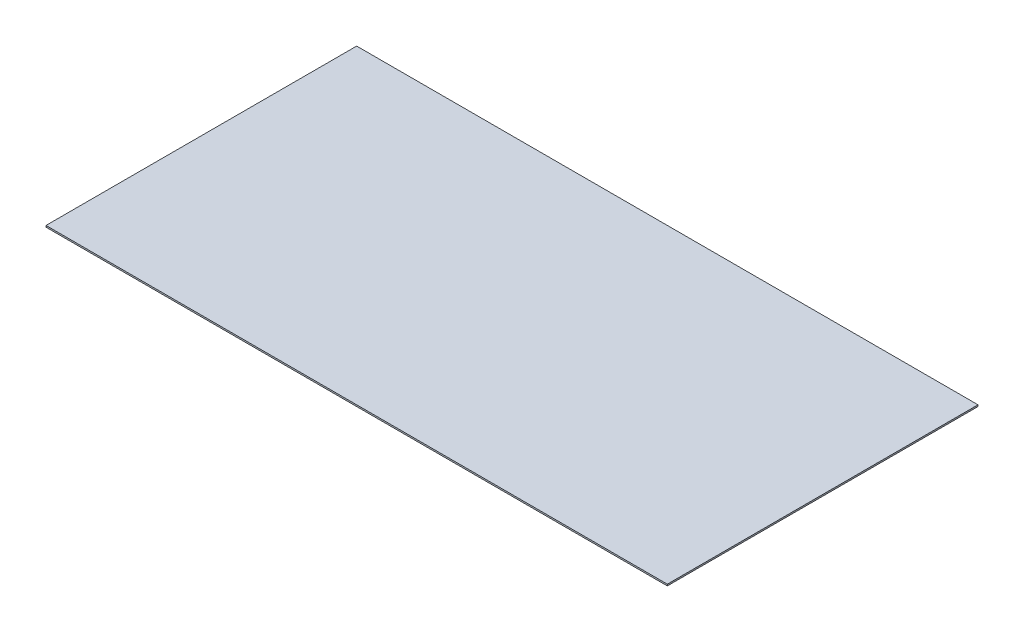
ISO-10303-21;
HEADER;
FILE_DESCRIPTION(('STEP AP214'),'2;1');
FILE_NAME('part.step','',(''),(''),'','','');
FILE_SCHEMA(('AUTOMOTIVE_DESIGN { 1 0 10303 214 1 1 1 1 }'));
ENDSEC;
DATA;
#1=APPLICATION_CONTEXT('core data for automotive mechanical design processes');
#2=APPLICATION_PROTOCOL_DEFINITION('international standard','automotive_design',2000,#1);
#3=PRODUCT_CONTEXT('',#1,'mechanical');
#4=PRODUCT('Part','Part','',(#3));
#5=PRODUCT_RELATED_PRODUCT_CATEGORY('part','',(#4));
#6=PRODUCT_DEFINITION_FORMATION('','',#4);
#7=PRODUCT_DEFINITION_CONTEXT('part definition',#1,'design');
#8=PRODUCT_DEFINITION('design','',#6,#7);
#9=PRODUCT_DEFINITION_SHAPE('','',#8);
#10=(LENGTH_UNIT() NAMED_UNIT(*) SI_UNIT(.MILLI.,.METRE.));
#11=(NAMED_UNIT(*) PLANE_ANGLE_UNIT() SI_UNIT($,.RADIAN.));
#12=(NAMED_UNIT(*) SI_UNIT($,.STERADIAN.) SOLID_ANGLE_UNIT());
#13=UNCERTAINTY_MEASURE_WITH_UNIT(LENGTH_MEASURE(1.E-05),#10,'distance_accuracy_value','');
#14=(GEOMETRIC_REPRESENTATION_CONTEXT(3) GLOBAL_UNCERTAINTY_ASSIGNED_CONTEXT((#13)) GLOBAL_UNIT_ASSIGNED_CONTEXT((#10,
#11,#12)) REPRESENTATION_CONTEXT('',''));
#15=CARTESIAN_POINT('',(0.,0.,0.));
#16=DIRECTION('',(0.,0.,1.));
#17=DIRECTION('',(1.,0.,0.));
#18=AXIS2_PLACEMENT_3D('',#15,#16,#17);
#19=CARTESIAN_POINT('',(600.,3.,-300.));
#20=DIRECTION('',(-1.,0.,0.));
#21=DIRECTION('',(0.,0.,1.));
#22=AXIS2_PLACEMENT_3D('',#19,#20,#21);
#23=PLANE('',#22);
#24=DIRECTION('',(0.,0.,-1.));
#25=VECTOR('',#24,1.);
#26=CARTESIAN_POINT('',(600.,0.,-300.));
#27=LINE('',#26,#25);
#28=CARTESIAN_POINT('',(600.,0.,300.));
#29=VERTEX_POINT('',#28);
#30=CARTESIAN_POINT('',(600.,0.,-300.));
#31=VERTEX_POINT('',#30);
#32=EDGE_CURVE('E95',#29,#31,#27,.T.);
#33=ORIENTED_EDGE('',*,*,#32,.T.);
#34=DIRECTION('',(0.,-1.,0.));
#35=VECTOR('',#34,1.);
#36=CARTESIAN_POINT('',(600.,3.,-300.));
#37=LINE('',#36,#35);
#38=CARTESIAN_POINT('',(600.,3.,-300.));
#39=VERTEX_POINT('',#38);
#40=EDGE_CURVE('E11',#39,#31,#37,.T.);
#41=ORIENTED_EDGE('',*,*,#40,.F.);
#42=DIRECTION('',(0.,0.,-1.));
#43=VECTOR('',#42,1.);
#44=CARTESIAN_POINT('',(600.,3.,-300.));
#45=LINE('',#44,#43);
#46=CARTESIAN_POINT('',(600.,3.,300.));
#47=VERTEX_POINT('',#46);
#48=EDGE_CURVE('E83',#47,#39,#45,.T.);
#49=ORIENTED_EDGE('',*,*,#48,.F.);
#50=DIRECTION('',(0.,-1.,0.));
#51=VECTOR('',#50,1.);
#52=CARTESIAN_POINT('',(600.,3.,300.));
#53=LINE('',#52,#51);
#54=EDGE_CURVE('E91',#47,#29,#53,.T.);
#55=ORIENTED_EDGE('',*,*,#54,.T.);
#56=EDGE_LOOP('',(#33,#41,#49,#55));
#57=FACE_BOUND('',#56,.T.);
#58=ADVANCED_FACE('F32',(#57),#23,.F.);
#59=CARTESIAN_POINT('',(-600.,3.,-300.));
#60=DIRECTION('',(0.,0.,1.));
#61=DIRECTION('',(1.,0.,0.));
#62=AXIS2_PLACEMENT_3D('',#59,#60,#61);
#63=PLANE('',#62);
#64=DIRECTION('',(-1.,0.,0.));
#65=VECTOR('',#64,1.);
#66=CARTESIAN_POINT('',(-600.,0.,-300.));
#67=LINE('',#66,#65);
#68=CARTESIAN_POINT('',(-600.,0.,-300.));
#69=VERTEX_POINT('',#68);
#70=EDGE_CURVE('E87',#31,#69,#67,.T.);
#71=ORIENTED_EDGE('',*,*,#70,.T.);
#72=DIRECTION('',(0.,-1.,0.));
#73=VECTOR('',#72,1.);
#74=CARTESIAN_POINT('',(-600.,3.,-300.));
#75=LINE('',#74,#73);
#76=CARTESIAN_POINT('',(-600.,3.,-300.));
#77=VERTEX_POINT('',#76);
#78=EDGE_CURVE('E40',#77,#69,#75,.T.);
#79=ORIENTED_EDGE('',*,*,#78,.F.);
#80=DIRECTION('',(-1.,0.,0.));
#81=VECTOR('',#80,1.);
#82=CARTESIAN_POINT('',(-600.,3.,-300.));
#83=LINE('',#82,#81);
#84=EDGE_CURVE('E78',#39,#77,#83,.T.);
#85=ORIENTED_EDGE('',*,*,#84,.F.);
#86=ORIENTED_EDGE('',*,*,#40,.T.);
#87=EDGE_LOOP('',(#71,#79,#85,#86));
#88=FACE_BOUND('',#87,.T.);
#89=ADVANCED_FACE('F86',(#88),#63,.F.);
#90=CARTESIAN_POINT('',(-600.,3.,-300.));
#91=DIRECTION('',(1.,0.,0.));
#92=DIRECTION('',(0.,0.,-1.));
#93=AXIS2_PLACEMENT_3D('',#90,#91,#92);
#94=PLANE('',#93);
#95=DIRECTION('',(0.,0.,1.));
#96=VECTOR('',#95,1.);
#97=CARTESIAN_POINT('',(-600.,0.,-300.));
#98=LINE('',#97,#96);
#99=CARTESIAN_POINT('',(-600.,0.,300.));
#100=VERTEX_POINT('',#99);
#101=EDGE_CURVE('E65',#69,#100,#98,.T.);
#102=ORIENTED_EDGE('',*,*,#101,.T.);
#103=DIRECTION('',(0.,-1.,0.));
#104=VECTOR('',#103,1.);
#105=CARTESIAN_POINT('',(-600.,3.,300.));
#106=LINE('',#105,#104);
#107=CARTESIAN_POINT('',(-600.,3.,300.));
#108=VERTEX_POINT('',#107);
#109=EDGE_CURVE('E88',#108,#100,#106,.T.);
#110=ORIENTED_EDGE('',*,*,#109,.F.);
#111=DIRECTION('',(0.,0.,1.));
#112=VECTOR('',#111,1.);
#113=CARTESIAN_POINT('',(-600.,3.,-300.));
#114=LINE('',#113,#112);
#115=EDGE_CURVE('E81',#77,#108,#114,.T.);
#116=ORIENTED_EDGE('',*,*,#115,.F.);
#117=ORIENTED_EDGE('',*,*,#78,.T.);
#118=EDGE_LOOP('',(#102,#110,#116,#117));
#119=FACE_BOUND('',#118,.T.);
#120=ADVANCED_FACE('F89',(#119),#94,.F.);
#121=CARTESIAN_POINT('',(-600.,3.,300.));
#122=DIRECTION('',(0.,0.,-1.));
#123=DIRECTION('',(-1.,0.,0.));
#124=AXIS2_PLACEMENT_3D('',#121,#122,#123);
#125=PLANE('',#124);
#126=DIRECTION('',(1.,0.,0.));
#127=VECTOR('',#126,1.);
#128=CARTESIAN_POINT('',(-600.,0.,300.));
#129=LINE('',#128,#127);
#130=EDGE_CURVE('E71',#100,#29,#129,.T.);
#131=ORIENTED_EDGE('',*,*,#130,.T.);
#132=ORIENTED_EDGE('',*,*,#54,.F.);
#133=DIRECTION('',(1.,0.,0.));
#134=VECTOR('',#133,1.);
#135=CARTESIAN_POINT('',(-600.,3.,300.));
#136=LINE('',#135,#134);
#137=EDGE_CURVE('E48',#108,#47,#136,.T.);
#138=ORIENTED_EDGE('',*,*,#137,.F.);
#139=ORIENTED_EDGE('',*,*,#109,.T.);
#140=EDGE_LOOP('',(#131,#132,#138,#139));
#141=FACE_BOUND('',#140,.T.);
#142=ADVANCED_FACE('F102',(#141),#125,.F.);
#143=CARTESIAN_POINT('',(0.,3.,0.));
#144=DIRECTION('',(0.,1.,0.));
#145=DIRECTION('',(0.,0.,1.));
#146=AXIS2_PLACEMENT_3D('',#143,#144,#145);
#147=PLANE('',#146);
#148=ORIENTED_EDGE('',*,*,#48,.T.);
#149=ORIENTED_EDGE('',*,*,#84,.T.);
#150=ORIENTED_EDGE('',*,*,#115,.T.);
#151=ORIENTED_EDGE('',*,*,#137,.T.);
#152=EDGE_LOOP('',(#148,#149,#150,#151));
#153=FACE_BOUND('',#152,.T.);
#154=ADVANCED_FACE('F79',(#153),#147,.T.);
#155=CARTESIAN_POINT('',(0.,0.,0.));
#156=DIRECTION('',(0.,1.,0.));
#157=DIRECTION('',(0.,0.,1.));
#158=AXIS2_PLACEMENT_3D('',#155,#156,#157);
#159=PLANE('',#158);
#160=ORIENTED_EDGE('',*,*,#32,.F.);
#161=ORIENTED_EDGE('',*,*,#130,.F.);
#162=ORIENTED_EDGE('',*,*,#101,.F.);
#163=ORIENTED_EDGE('',*,*,#70,.F.);
#164=EDGE_LOOP('',(#160,#161,#162,#163));
#165=FACE_BOUND('',#164,.T.);
#166=ADVANCED_FACE('F105',(#165),#159,.F.);
#167=CLOSED_SHELL('',(#58,#89,#120,#142,#154,#166));
#168=MANIFOLD_SOLID_BREP('B2',#167);
#169=ADVANCED_BREP_SHAPE_REPRESENTATION('',(#18,#168),#14);
#170=SHAPE_DEFINITION_REPRESENTATION(#9,#169);
ENDSEC;
END-ISO-10303-21;
